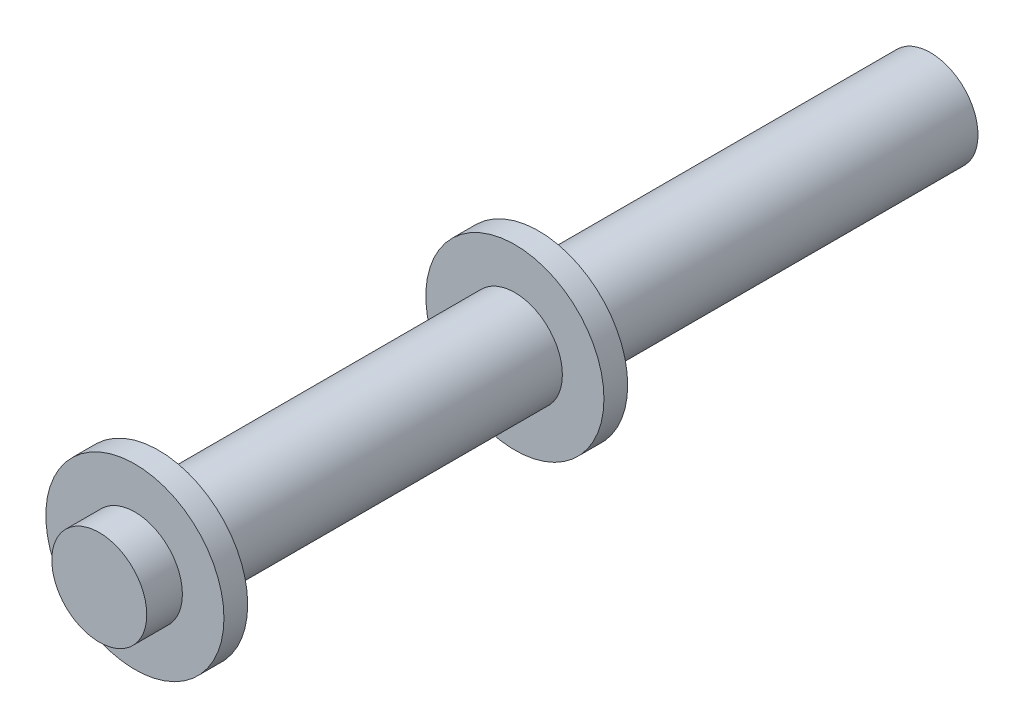
ISO-10303-21;
HEADER;
FILE_DESCRIPTION(('STEP AP214'),'2;1');
FILE_NAME('part.step','',(''),(''),'','','');
FILE_SCHEMA(('AUTOMOTIVE_DESIGN { 1 0 10303 214 1 1 1 1 }'));
ENDSEC;
DATA;
#1=APPLICATION_CONTEXT('core data for automotive mechanical design processes');
#2=APPLICATION_PROTOCOL_DEFINITION('international standard','automotive_design',2000,#1);
#3=PRODUCT_CONTEXT('',#1,'mechanical');
#4=PRODUCT('Part','Part','',(#3));
#5=PRODUCT_RELATED_PRODUCT_CATEGORY('part','',(#4));
#6=PRODUCT_DEFINITION_FORMATION('','',#4);
#7=PRODUCT_DEFINITION_CONTEXT('part definition',#1,'design');
#8=PRODUCT_DEFINITION('design','',#6,#7);
#9=PRODUCT_DEFINITION_SHAPE('','',#8);
#10=(LENGTH_UNIT() NAMED_UNIT(*) SI_UNIT(.MILLI.,.METRE.));
#11=(NAMED_UNIT(*) PLANE_ANGLE_UNIT() SI_UNIT($,.RADIAN.));
#12=(NAMED_UNIT(*) SI_UNIT($,.STERADIAN.) SOLID_ANGLE_UNIT());
#13=UNCERTAINTY_MEASURE_WITH_UNIT(LENGTH_MEASURE(1.E-05),#10,'distance_accuracy_value','');
#14=(GEOMETRIC_REPRESENTATION_CONTEXT(3) GLOBAL_UNCERTAINTY_ASSIGNED_CONTEXT((#13)) GLOBAL_UNIT_ASSIGNED_CONTEXT((#10,
#11,#12)) REPRESENTATION_CONTEXT('',''));
#15=CARTESIAN_POINT('',(0.,0.,0.));
#16=DIRECTION('',(0.,0.,1.));
#17=DIRECTION('',(1.,0.,0.));
#18=AXIS2_PLACEMENT_3D('',#15,#16,#17);
#19=CARTESIAN_POINT('',(0.,0.,177.8));
#20=DIRECTION('',(0.,0.,-1.));
#21=DIRECTION('',(-1.,0.,0.));
#22=AXIS2_PLACEMENT_3D('',#19,#20,#21);
#23=CYLINDRICAL_SURFACE('',#22,10.16);
#24=CARTESIAN_POINT('',(0.,0.,170.18));
#25=DIRECTION('',(0.,0.,1.));
#26=DIRECTION('',(1.,0.,0.));
#27=AXIS2_PLACEMENT_3D('',#24,#25,#26);
#28=CIRCLE('',#27,10.16);
#29=CARTESIAN_POINT('',(10.16,0.,170.18));
#30=VERTEX_POINT('',#29);
#31=EDGE_CURVE('E59',#30,#30,#28,.T.);
#32=ORIENTED_EDGE('',*,*,#31,.T.);
#33=EDGE_LOOP('',(#32));
#34=FACE_BOUND('',#33,.T.);
#35=CARTESIAN_POINT('',(0.,0.,177.8));
#36=DIRECTION('',(0.,0.,1.));
#37=DIRECTION('',(1.,0.,0.));
#38=AXIS2_PLACEMENT_3D('',#35,#36,#37);
#39=CIRCLE('',#38,10.16);
#40=CARTESIAN_POINT('',(10.16,0.,177.8));
#41=VERTEX_POINT('',#40);
#42=EDGE_CURVE('E49',#41,#41,#39,.T.);
#43=ORIENTED_EDGE('',*,*,#42,.F.);
#44=EDGE_LOOP('',(#43));
#45=FACE_BOUND('',#44,.T.);
#46=ADVANCED_FACE('F37',(#34,#45),#23,.T.);
#47=CARTESIAN_POINT('',(0.,0.,177.8));
#48=DIRECTION('',(0.,0.,1.));
#49=DIRECTION('',(1.,0.,0.));
#50=AXIS2_PLACEMENT_3D('',#47,#48,#49);
#51=PLANE('',#50);
#52=ORIENTED_EDGE('',*,*,#42,.T.);
#53=EDGE_LOOP('',(#52));
#54=FACE_BOUND('',#53,.T.);
#55=ADVANCED_FACE('F92',(#54),#51,.T.);
#56=CARTESIAN_POINT('',(0.,0.,170.18));
#57=DIRECTION('',(0.,0.,-1.));
#58=DIRECTION('',(-1.,0.,0.));
#59=AXIS2_PLACEMENT_3D('',#56,#57,#58);
#60=CYLINDRICAL_SURFACE('',#59,19.05);
#61=CARTESIAN_POINT('',(0.,0.,170.18));
#62=DIRECTION('',(0.,0.,1.));
#63=DIRECTION('',(1.,0.,0.));
#64=AXIS2_PLACEMENT_3D('',#61,#62,#63);
#65=CIRCLE('',#64,19.05);
#66=CARTESIAN_POINT('',(19.05,0.,170.18));
#67=VERTEX_POINT('',#66);
#68=EDGE_CURVE('E62',#67,#67,#65,.T.);
#69=ORIENTED_EDGE('',*,*,#68,.F.);
#70=EDGE_LOOP('',(#69));
#71=FACE_BOUND('',#70,.T.);
#72=CARTESIAN_POINT('',(0.,0.,165.1));
#73=DIRECTION('',(0.,0.,1.));
#74=DIRECTION('',(1.,0.,0.));
#75=AXIS2_PLACEMENT_3D('',#72,#73,#74);
#76=CIRCLE('',#75,19.05);
#77=CARTESIAN_POINT('',(19.05,0.,165.1));
#78=VERTEX_POINT('',#77);
#79=EDGE_CURVE('E66',#78,#78,#76,.T.);
#80=ORIENTED_EDGE('',*,*,#79,.T.);
#81=EDGE_LOOP('',(#80));
#82=FACE_BOUND('',#81,.T.);
#83=ADVANCED_FACE('F89',(#71,#82),#60,.T.);
#84=CARTESIAN_POINT('',(0.,0.,170.18));
#85=DIRECTION('',(0.,0.,1.));
#86=DIRECTION('',(1.,0.,0.));
#87=AXIS2_PLACEMENT_3D('',#84,#85,#86);
#88=PLANE('',#87);
#89=ORIENTED_EDGE('',*,*,#31,.F.);
#90=EDGE_LOOP('',(#89));
#91=FACE_BOUND('',#90,.T.);
#92=ORIENTED_EDGE('',*,*,#68,.T.);
#93=EDGE_LOOP('',(#92));
#94=FACE_BOUND('',#93,.T.);
#95=ADVANCED_FACE('F87',(#91,#94),#88,.T.);
#96=CARTESIAN_POINT('',(0.,0.,165.1));
#97=DIRECTION('',(0.,0.,1.));
#98=DIRECTION('',(1.,0.,0.));
#99=AXIS2_PLACEMENT_3D('',#96,#97,#98);
#100=PLANE('',#99);
#101=CARTESIAN_POINT('',(0.,0.,165.1));
#102=DIRECTION('',(0.,0.,1.));
#103=DIRECTION('',(1.,0.,0.));
#104=AXIS2_PLACEMENT_3D('',#101,#102,#103);
#105=CIRCLE('',#104,10.16);
#106=CARTESIAN_POINT('',(10.16,0.,165.1));
#107=VERTEX_POINT('',#106);
#108=EDGE_CURVE('E44',#107,#107,#105,.T.);
#109=ORIENTED_EDGE('',*,*,#108,.T.);
#110=EDGE_LOOP('',(#109));
#111=FACE_BOUND('',#110,.T.);
#112=ORIENTED_EDGE('',*,*,#79,.F.);
#113=EDGE_LOOP('',(#112));
#114=FACE_BOUND('',#113,.T.);
#115=ADVANCED_FACE('F96',(#111,#114),#100,.F.);
#116=CARTESIAN_POINT('',(0.,0.,88.8999999999999));
#117=DIRECTION('',(0.,0.,1.));
#118=DIRECTION('',(1.,0.,0.));
#119=AXIS2_PLACEMENT_3D('',#116,#117,#118);
#120=CIRCLE('',#119,10.16);
#121=CARTESIAN_POINT('',(10.16,0.,88.8999999999999));
#122=VERTEX_POINT('',#121);
#123=EDGE_CURVE('E63',#122,#122,#120,.T.);
#124=ORIENTED_EDGE('',*,*,#123,.T.);
#125=EDGE_LOOP('',(#124));
#126=FACE_BOUND('',#125,.T.);
#127=ORIENTED_EDGE('',*,*,#108,.F.);
#128=EDGE_LOOP('',(#127));
#129=FACE_BOUND('',#128,.T.);
#130=ADVANCED_FACE('F98',(#126,#129),#23,.T.);
#131=CARTESIAN_POINT('',(0.,0.,83.8199999999999));
#132=DIRECTION('',(0.,0.,1.));
#133=DIRECTION('',(1.,0.,0.));
#134=AXIS2_PLACEMENT_3D('',#131,#132,#133);
#135=CYLINDRICAL_SURFACE('',#134,19.05);
#136=CARTESIAN_POINT('',(0.,0.,83.8199999999999));
#137=DIRECTION('',(0.,0.,1.));
#138=DIRECTION('',(1.,0.,0.));
#139=AXIS2_PLACEMENT_3D('',#136,#137,#138);
#140=CIRCLE('',#139,19.05);
#141=CARTESIAN_POINT('',(19.05,0.,83.8199999999999));
#142=VERTEX_POINT('',#141);
#143=EDGE_CURVE('E67',#142,#142,#140,.T.);
#144=ORIENTED_EDGE('',*,*,#143,.T.);
#145=EDGE_LOOP('',(#144));
#146=FACE_BOUND('',#145,.T.);
#147=CARTESIAN_POINT('',(0.,0.,88.8999999999999));
#148=DIRECTION('',(0.,0.,1.));
#149=DIRECTION('',(1.,0.,0.));
#150=AXIS2_PLACEMENT_3D('',#147,#148,#149);
#151=CIRCLE('',#150,19.05);
#152=CARTESIAN_POINT('',(19.05,0.,88.8999999999999));
#153=VERTEX_POINT('',#152);
#154=EDGE_CURVE('E75',#153,#153,#151,.T.);
#155=ORIENTED_EDGE('',*,*,#154,.F.);
#156=EDGE_LOOP('',(#155));
#157=FACE_BOUND('',#156,.T.);
#158=ADVANCED_FACE('F105',(#146,#157),#135,.T.);
#159=CARTESIAN_POINT('',(0.,0.,83.8199999999999));
#160=DIRECTION('',(0.,0.,1.));
#161=DIRECTION('',(1.,0.,0.));
#162=AXIS2_PLACEMENT_3D('',#159,#160,#161);
#163=PLANE('',#162);
#164=CARTESIAN_POINT('',(0.,0.,83.8199999999999));
#165=DIRECTION('',(0.,0.,1.));
#166=DIRECTION('',(1.,0.,0.));
#167=AXIS2_PLACEMENT_3D('',#164,#165,#166);
#168=CIRCLE('',#167,10.16);
#169=CARTESIAN_POINT('',(10.16,0.,83.8199999999999));
#170=VERTEX_POINT('',#169);
#171=EDGE_CURVE('E10',#170,#170,#168,.T.);
#172=ORIENTED_EDGE('',*,*,#171,.T.);
#173=EDGE_LOOP('',(#172));
#174=FACE_BOUND('',#173,.T.);
#175=ORIENTED_EDGE('',*,*,#143,.F.);
#176=EDGE_LOOP('',(#175));
#177=FACE_BOUND('',#176,.T.);
#178=ADVANCED_FACE('F135',(#174,#177),#163,.F.);
#179=CARTESIAN_POINT('',(0.,0.,88.8999999999999));
#180=DIRECTION('',(0.,0.,1.));
#181=DIRECTION('',(1.,0.,0.));
#182=AXIS2_PLACEMENT_3D('',#179,#180,#181);
#183=PLANE('',#182);
#184=ORIENTED_EDGE('',*,*,#123,.F.);
#185=EDGE_LOOP('',(#184));
#186=FACE_BOUND('',#185,.T.);
#187=ORIENTED_EDGE('',*,*,#154,.T.);
#188=EDGE_LOOP('',(#187));
#189=FACE_BOUND('',#188,.T.);
#190=ADVANCED_FACE('F126',(#186,#189),#183,.T.);
#191=CARTESIAN_POINT('',(0.,0.,0.));
#192=DIRECTION('',(0.,0.,1.));
#193=DIRECTION('',(1.,0.,0.));
#194=AXIS2_PLACEMENT_3D('',#191,#192,#193);
#195=PLANE('',#194);
#196=CARTESIAN_POINT('',(0.,0.,0.));
#197=DIRECTION('',(0.,0.,1.));
#198=DIRECTION('',(1.,0.,0.));
#199=AXIS2_PLACEMENT_3D('',#196,#197,#198);
#200=CIRCLE('',#199,10.16);
#201=CARTESIAN_POINT('',(10.16,0.,0.));
#202=VERTEX_POINT('',#201);
#203=EDGE_CURVE('E55',#202,#202,#200,.T.);
#204=ORIENTED_EDGE('',*,*,#203,.F.);
#205=EDGE_LOOP('',(#204));
#206=FACE_BOUND('',#205,.T.);
#207=ADVANCED_FACE('F120',(#206),#195,.F.);
#208=ORIENTED_EDGE('',*,*,#203,.T.);
#209=EDGE_LOOP('',(#208));
#210=FACE_BOUND('',#209,.T.);
#211=ORIENTED_EDGE('',*,*,#171,.F.);
#212=EDGE_LOOP('',(#211));
#213=FACE_BOUND('',#212,.T.);
#214=ADVANCED_FACE('F106',(#210,#213),#23,.T.);
#215=CLOSED_SHELL('',(#46,#55,#83,#95,#115,#130,#158,#178,#190,#207,#214));
#216=MANIFOLD_SOLID_BREP('B2',#215);
#217=ADVANCED_BREP_SHAPE_REPRESENTATION('',(#18,#216),#14);
#218=SHAPE_DEFINITION_REPRESENTATION(#9,#217);
ENDSEC;
END-ISO-10303-21;
